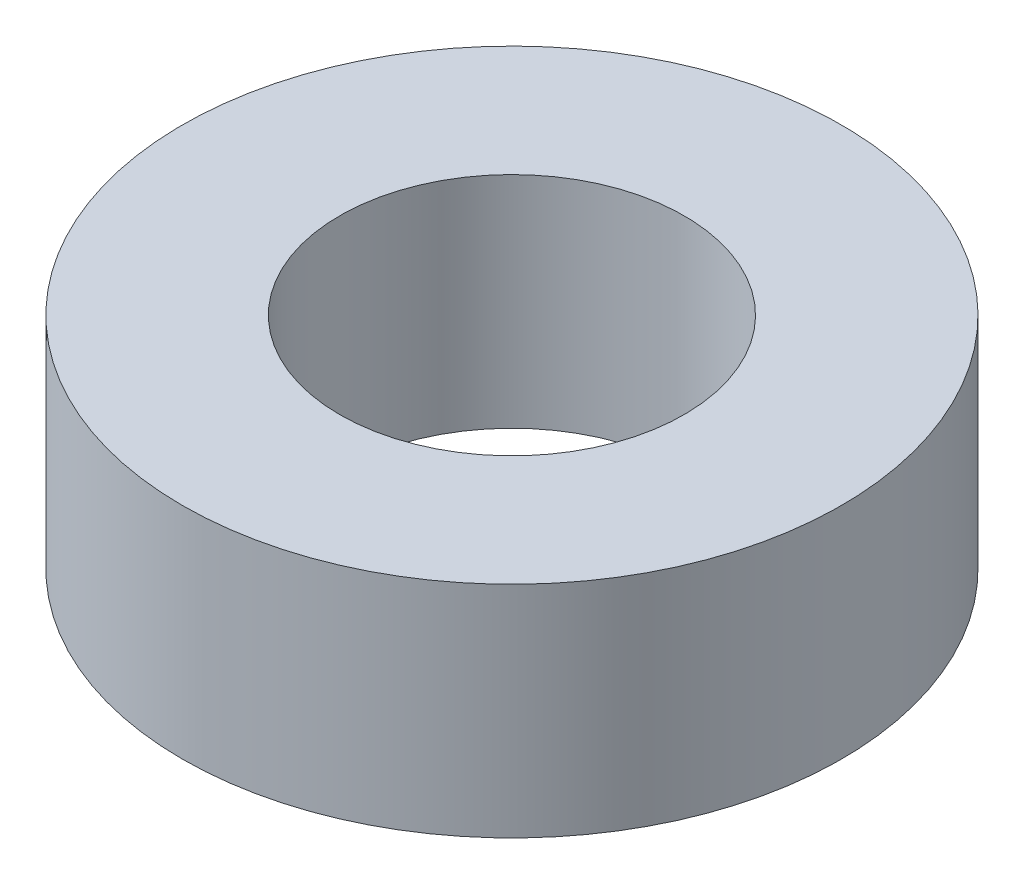
ISO-10303-21;
HEADER;
FILE_DESCRIPTION(('STEP AP214'),'2;1');
FILE_NAME('part.step','',(''),(''),'','','');
FILE_SCHEMA(('AUTOMOTIVE_DESIGN { 1 0 10303 214 1 1 1 1 }'));
ENDSEC;
DATA;
#1=APPLICATION_CONTEXT('core data for automotive mechanical design processes');
#2=APPLICATION_PROTOCOL_DEFINITION('international standard','automotive_design',2000,#1);
#3=PRODUCT_CONTEXT('',#1,'mechanical');
#4=PRODUCT('Part','Part','',(#3));
#5=PRODUCT_RELATED_PRODUCT_CATEGORY('part','',(#4));
#6=PRODUCT_DEFINITION_FORMATION('','',#4);
#7=PRODUCT_DEFINITION_CONTEXT('part definition',#1,'design');
#8=PRODUCT_DEFINITION('design','',#6,#7);
#9=PRODUCT_DEFINITION_SHAPE('','',#8);
#10=(LENGTH_UNIT() NAMED_UNIT(*) SI_UNIT(.MILLI.,.METRE.));
#11=(NAMED_UNIT(*) PLANE_ANGLE_UNIT() SI_UNIT($,.RADIAN.));
#12=(NAMED_UNIT(*) SI_UNIT($,.STERADIAN.) SOLID_ANGLE_UNIT());
#13=UNCERTAINTY_MEASURE_WITH_UNIT(LENGTH_MEASURE(1.E-05),#10,'distance_accuracy_value','');
#14=(GEOMETRIC_REPRESENTATION_CONTEXT(3) GLOBAL_UNCERTAINTY_ASSIGNED_CONTEXT((#13)) GLOBAL_UNIT_ASSIGNED_CONTEXT((#10,
#11,#12)) REPRESENTATION_CONTEXT('',''));
#15=CARTESIAN_POINT('',(0.,0.,0.));
#16=DIRECTION('',(0.,0.,1.));
#17=DIRECTION('',(1.,0.,0.));
#18=AXIS2_PLACEMENT_3D('',#15,#16,#17);
#19=CARTESIAN_POINT('',(0.,1.5875,0.));
#20=DIRECTION('',(0.,1.,0.));
#21=DIRECTION('',(0.,0.,1.));
#22=AXIS2_PLACEMENT_3D('',#19,#20,#21);
#23=PLANE('',#22);
#24=CARTESIAN_POINT('',(0.,1.5875,0.));
#25=DIRECTION('',(0.,1.,0.));
#26=DIRECTION('',(0.,0.,1.));
#27=AXIS2_PLACEMENT_3D('',#24,#25,#26);
#28=CIRCLE('',#27,4.7625);
#29=CARTESIAN_POINT('',(0.,1.5875,4.7625));
#30=VERTEX_POINT('',#29);
#31=EDGE_CURVE('E10',#30,#30,#28,.T.);
#32=ORIENTED_EDGE('',*,*,#31,.T.);
#33=EDGE_LOOP('',(#32));
#34=FACE_BOUND('',#33,.T.);
#35=CARTESIAN_POINT('',(0.,1.5875,0.));
#36=DIRECTION('',(0.,1.,0.));
#37=DIRECTION('',(0.,0.,1.));
#38=AXIS2_PLACEMENT_3D('',#35,#36,#37);
#39=CIRCLE('',#38,2.4892);
#40=CARTESIAN_POINT('',(0.,1.5875,2.4892));
#41=VERTEX_POINT('',#40);
#42=EDGE_CURVE('E50',#41,#41,#39,.T.);
#43=ORIENTED_EDGE('',*,*,#42,.F.);
#44=EDGE_LOOP('',(#43));
#45=FACE_BOUND('',#44,.T.);
#46=ADVANCED_FACE('F37',(#34,#45),#23,.T.);
#47=CARTESIAN_POINT('',(0.,-1.5875,0.));
#48=DIRECTION('',(0.,1.,0.));
#49=DIRECTION('',(0.,0.,1.));
#50=AXIS2_PLACEMENT_3D('',#47,#48,#49);
#51=PLANE('',#50);
#52=CARTESIAN_POINT('',(0.,-1.5875,0.));
#53=DIRECTION('',(0.,1.,0.));
#54=DIRECTION('',(0.,0.,1.));
#55=AXIS2_PLACEMENT_3D('',#52,#53,#54);
#56=CIRCLE('',#55,4.7625);
#57=CARTESIAN_POINT('',(0.,-1.5875,4.7625));
#58=VERTEX_POINT('',#57);
#59=EDGE_CURVE('E41',#58,#58,#56,.T.);
#60=ORIENTED_EDGE('',*,*,#59,.F.);
#61=EDGE_LOOP('',(#60));
#62=FACE_BOUND('',#61,.T.);
#63=CARTESIAN_POINT('',(0.,-1.5875,0.));
#64=DIRECTION('',(0.,1.,0.));
#65=DIRECTION('',(0.,0.,1.));
#66=AXIS2_PLACEMENT_3D('',#63,#64,#65);
#67=CIRCLE('',#66,2.4892);
#68=CARTESIAN_POINT('',(0.,-1.5875,2.4892));
#69=VERTEX_POINT('',#68);
#70=EDGE_CURVE('E52',#69,#69,#67,.T.);
#71=ORIENTED_EDGE('',*,*,#70,.T.);
#72=EDGE_LOOP('',(#71));
#73=FACE_BOUND('',#72,.T.);
#74=ADVANCED_FACE('F64',(#62,#73),#51,.F.);
#75=CARTESIAN_POINT('',(0.,1.5875,0.));
#76=DIRECTION('',(0.,-1.,0.));
#77=DIRECTION('',(0.,0.,-1.));
#78=AXIS2_PLACEMENT_3D('',#75,#76,#77);
#79=CYLINDRICAL_SURFACE('',#78,4.7625);
#80=ORIENTED_EDGE('',*,*,#31,.F.);
#81=EDGE_LOOP('',(#80));
#82=FACE_BOUND('',#81,.T.);
#83=ORIENTED_EDGE('',*,*,#59,.T.);
#84=EDGE_LOOP('',(#83));
#85=FACE_BOUND('',#84,.T.);
#86=ADVANCED_FACE('F39',(#82,#85),#79,.T.);
#87=CARTESIAN_POINT('',(0.,1.5875,0.));
#88=DIRECTION('',(0.,-1.,0.));
#89=DIRECTION('',(0.,0.,-1.));
#90=AXIS2_PLACEMENT_3D('',#87,#88,#89);
#91=CYLINDRICAL_SURFACE('',#90,2.4892);
#92=ORIENTED_EDGE('',*,*,#42,.T.);
#93=EDGE_LOOP('',(#92));
#94=FACE_BOUND('',#93,.T.);
#95=ORIENTED_EDGE('',*,*,#70,.F.);
#96=EDGE_LOOP('',(#95));
#97=FACE_BOUND('',#96,.T.);
#98=ADVANCED_FACE('F60',(#94,#97),#91,.F.);
#99=CLOSED_SHELL('',(#46,#74,#86,#98));
#100=MANIFOLD_SOLID_BREP('B2',#99);
#101=ADVANCED_BREP_SHAPE_REPRESENTATION('',(#18,#100),#14);
#102=SHAPE_DEFINITION_REPRESENTATION(#9,#101);
ENDSEC;
END-ISO-10303-21;
